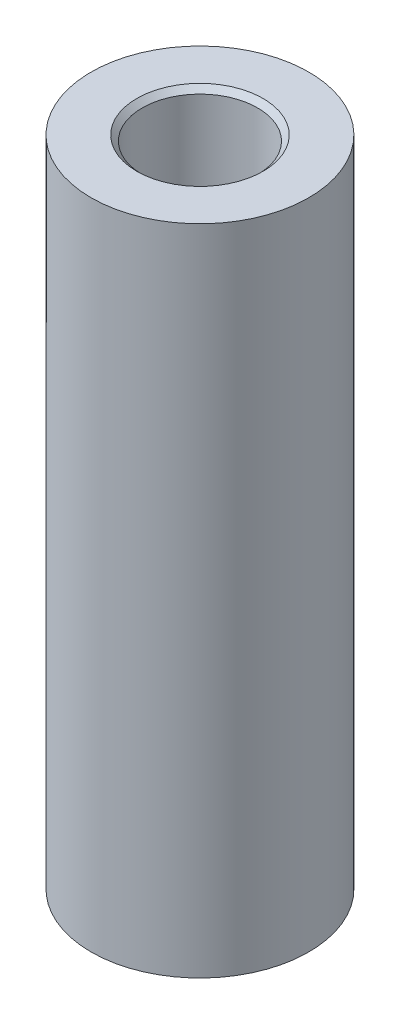
ISO-10303-21;
HEADER;
FILE_DESCRIPTION(('STEP AP214'),'2;1');
FILE_NAME('part.step','',(''),(''),'','','');
FILE_SCHEMA(('AUTOMOTIVE_DESIGN { 1 0 10303 214 1 1 1 1 }'));
ENDSEC;
DATA;
#1=APPLICATION_CONTEXT('core data for automotive mechanical design processes');
#2=APPLICATION_PROTOCOL_DEFINITION('international standard','automotive_design',2000,#1);
#3=PRODUCT_CONTEXT('',#1,'mechanical');
#4=PRODUCT('Part','Part','',(#3));
#5=PRODUCT_RELATED_PRODUCT_CATEGORY('part','',(#4));
#6=PRODUCT_DEFINITION_FORMATION('','',#4);
#7=PRODUCT_DEFINITION_CONTEXT('part definition',#1,'design');
#8=PRODUCT_DEFINITION('design','',#6,#7);
#9=PRODUCT_DEFINITION_SHAPE('','',#8);
#10=(LENGTH_UNIT() NAMED_UNIT(*) SI_UNIT(.MILLI.,.METRE.));
#11=(NAMED_UNIT(*) PLANE_ANGLE_UNIT() SI_UNIT($,.RADIAN.));
#12=(NAMED_UNIT(*) SI_UNIT($,.STERADIAN.) SOLID_ANGLE_UNIT());
#13=UNCERTAINTY_MEASURE_WITH_UNIT(LENGTH_MEASURE(1.E-05),#10,'distance_accuracy_value','');
#14=(GEOMETRIC_REPRESENTATION_CONTEXT(3) GLOBAL_UNCERTAINTY_ASSIGNED_CONTEXT((#13)) GLOBAL_UNIT_ASSIGNED_CONTEXT((#10,
#11,#12)) REPRESENTATION_CONTEXT('',''));
#15=CARTESIAN_POINT('',(0.,0.,0.));
#16=DIRECTION('',(0.,0.,1.));
#17=DIRECTION('',(1.,0.,0.));
#18=AXIS2_PLACEMENT_3D('',#15,#16,#17);
#19=CARTESIAN_POINT('',(0.,15.,0.));
#20=DIRECTION('',(0.,-1.,0.));
#21=DIRECTION('',(0.,0.,-1.));
#22=AXIS2_PLACEMENT_3D('',#19,#20,#21);
#23=CYLINDRICAL_SURFACE('',#22,5.);
#24=CARTESIAN_POINT('',(0.,15.,0.));
#25=DIRECTION('',(0.,1.,0.));
#26=DIRECTION('',(0.,0.,1.));
#27=AXIS2_PLACEMENT_3D('',#24,#25,#26);
#28=CIRCLE('',#27,5.);
#29=CARTESIAN_POINT('',(0.,15.,5.));
#30=VERTEX_POINT('',#29);
#31=EDGE_CURVE('E57',#30,#30,#28,.T.);
#32=ORIENTED_EDGE('',*,*,#31,.F.);
#33=EDGE_LOOP('',(#32));
#34=FACE_BOUND('',#33,.T.);
#35=CARTESIAN_POINT('',(0.,-15.,0.));
#36=DIRECTION('',(0.,1.,0.));
#37=DIRECTION('',(0.,0.,1.));
#38=AXIS2_PLACEMENT_3D('',#35,#36,#37);
#39=CIRCLE('',#38,5.);
#40=CARTESIAN_POINT('',(0.,-15.,5.));
#41=VERTEX_POINT('',#40);
#42=EDGE_CURVE('E58',#41,#41,#39,.T.);
#43=ORIENTED_EDGE('',*,*,#42,.T.);
#44=EDGE_LOOP('',(#43));
#45=FACE_BOUND('',#44,.T.);
#46=ADVANCED_FACE('F36',(#34,#45),#23,.T.);
#47=CARTESIAN_POINT('',(0.,15.,0.));
#48=DIRECTION('',(0.,1.,0.));
#49=DIRECTION('',(0.,0.,1.));
#50=AXIS2_PLACEMENT_3D('',#47,#48,#49);
#51=PLANE('',#50);
#52=CARTESIAN_POINT('',(0.,15.,0.));
#53=DIRECTION('',(0.,1.,0.));
#54=DIRECTION('',(0.,0.,1.));
#55=AXIS2_PLACEMENT_3D('',#52,#53,#54);
#56=CIRCLE('',#55,2.9);
#57=CARTESIAN_POINT('',(0.,15.,2.9));
#58=VERTEX_POINT('',#57);
#59=EDGE_CURVE('E44',#58,#58,#56,.F.);
#60=ORIENTED_EDGE('',*,*,#59,.T.);
#61=EDGE_LOOP('',(#60));
#62=FACE_BOUND('',#61,.T.);
#63=ORIENTED_EDGE('',*,*,#31,.T.);
#64=EDGE_LOOP('',(#63));
#65=FACE_BOUND('',#64,.T.);
#66=ADVANCED_FACE('F64',(#62,#65),#51,.T.);
#67=CARTESIAN_POINT('',(0.,-15.,0.));
#68=DIRECTION('',(0.,1.,0.));
#69=DIRECTION('',(0.,0.,1.));
#70=AXIS2_PLACEMENT_3D('',#67,#68,#69);
#71=PLANE('',#70);
#72=CARTESIAN_POINT('',(0.,-15.,0.));
#73=DIRECTION('',(0.,1.,0.));
#74=DIRECTION('',(0.,0.,1.));
#75=AXIS2_PLACEMENT_3D('',#72,#73,#74);
#76=CIRCLE('',#75,2.89999999999999);
#77=CARTESIAN_POINT('',(0.,-15.,2.89999999999999));
#78=VERTEX_POINT('',#77);
#79=EDGE_CURVE('E10',#78,#78,#76,.T.);
#80=ORIENTED_EDGE('',*,*,#79,.T.);
#81=EDGE_LOOP('',(#80));
#82=FACE_BOUND('',#81,.T.);
#83=ORIENTED_EDGE('',*,*,#42,.F.);
#84=EDGE_LOOP('',(#83));
#85=FACE_BOUND('',#84,.T.);
#86=ADVANCED_FACE('F71',(#82,#85),#71,.F.);
#87=CARTESIAN_POINT('',(0.,15.,0.));
#88=DIRECTION('',(0.,1.,0.));
#89=DIRECTION('',(0.,0.,1.));
#90=AXIS2_PLACEMENT_3D('',#87,#88,#89);
#91=CYLINDRICAL_SURFACE('',#90,2.65);
#92=CARTESIAN_POINT('',(0.,14.75,0.));
#93=DIRECTION('',(0.,1.,0.));
#94=DIRECTION('',(0.,0.,1.));
#95=AXIS2_PLACEMENT_3D('',#92,#93,#94);
#96=CIRCLE('',#95,2.65);
#97=CARTESIAN_POINT('',(0.,14.75,2.65));
#98=VERTEX_POINT('',#97);
#99=EDGE_CURVE('E48',#98,#98,#96,.T.);
#100=ORIENTED_EDGE('',*,*,#99,.T.);
#101=EDGE_LOOP('',(#100));
#102=FACE_BOUND('',#101,.T.);
#103=CARTESIAN_POINT('',(0.,-14.75,0.));
#104=DIRECTION('',(0.,1.,0.));
#105=DIRECTION('',(0.,0.,1.));
#106=AXIS2_PLACEMENT_3D('',#103,#104,#105);
#107=CIRCLE('',#106,2.65);
#108=CARTESIAN_POINT('',(0.,-14.75,2.65));
#109=VERTEX_POINT('',#108);
#110=EDGE_CURVE('E52',#109,#109,#107,.F.);
#111=ORIENTED_EDGE('',*,*,#110,.T.);
#112=EDGE_LOOP('',(#111));
#113=FACE_BOUND('',#112,.T.);
#114=ADVANCED_FACE('F73',(#102,#113),#91,.F.);
#115=CARTESIAN_POINT('',(0.,14.75,0.));
#116=DIRECTION('',(0.,1.,0.));
#117=DIRECTION('',(0.,0.,1.));
#118=AXIS2_PLACEMENT_3D('',#115,#116,#117);
#119=CONICAL_SURFACE('',#118,2.65,0.785398163397447);
#120=ORIENTED_EDGE('',*,*,#59,.F.);
#121=EDGE_LOOP('',(#120));
#122=FACE_BOUND('',#121,.T.);
#123=ORIENTED_EDGE('',*,*,#99,.F.);
#124=EDGE_LOOP('',(#123));
#125=FACE_BOUND('',#124,.T.);
#126=ADVANCED_FACE('F79',(#122,#125),#119,.F.);
#127=CARTESIAN_POINT('',(0.,-15.,0.));
#128=DIRECTION('',(0.,-1.,0.));
#129=DIRECTION('',(0.,0.,-1.));
#130=AXIS2_PLACEMENT_3D('',#127,#128,#129);
#131=CONICAL_SURFACE('',#130,2.89999999999999,0.785398163397447);
#132=ORIENTED_EDGE('',*,*,#110,.F.);
#133=EDGE_LOOP('',(#132));
#134=FACE_BOUND('',#133,.T.);
#135=ORIENTED_EDGE('',*,*,#79,.F.);
#136=EDGE_LOOP('',(#135));
#137=FACE_BOUND('',#136,.T.);
#138=ADVANCED_FACE('F39',(#134,#137),#131,.F.);
#139=CLOSED_SHELL('',(#46,#66,#86,#114,#126,#138));
#140=MANIFOLD_SOLID_BREP('B2',#139);
#141=ADVANCED_BREP_SHAPE_REPRESENTATION('',(#18,#140),#14);
#142=SHAPE_DEFINITION_REPRESENTATION(#9,#141);
ENDSEC;
END-ISO-10303-21;
